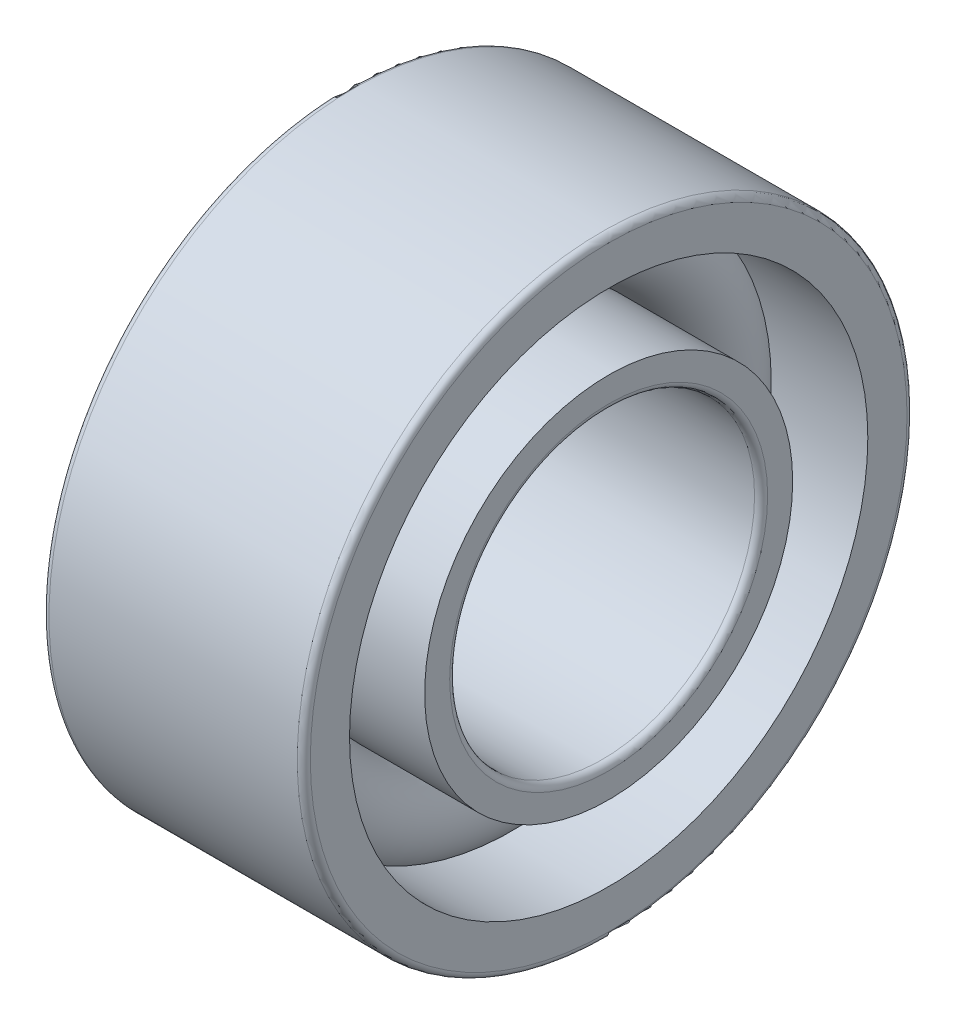
ISO-10303-21;
HEADER;
FILE_DESCRIPTION(('STEP AP214'),'2;1');
FILE_NAME('part.step','',(''),(''),'','','');
FILE_SCHEMA(('AUTOMOTIVE_DESIGN { 1 0 10303 214 1 1 1 1 }'));
ENDSEC;
DATA;
#1=APPLICATION_CONTEXT('core data for automotive mechanical design processes');
#2=APPLICATION_PROTOCOL_DEFINITION('international standard','automotive_design',2000,#1);
#3=PRODUCT_CONTEXT('',#1,'mechanical');
#4=PRODUCT('Part','Part','',(#3));
#5=PRODUCT_RELATED_PRODUCT_CATEGORY('part','',(#4));
#6=PRODUCT_DEFINITION_FORMATION('','',#4);
#7=PRODUCT_DEFINITION_CONTEXT('part definition',#1,'design');
#8=PRODUCT_DEFINITION('design','',#6,#7);
#9=PRODUCT_DEFINITION_SHAPE('','',#8);
#10=(LENGTH_UNIT() NAMED_UNIT(*) SI_UNIT(.MILLI.,.METRE.));
#11=(NAMED_UNIT(*) PLANE_ANGLE_UNIT() SI_UNIT($,.RADIAN.));
#12=(NAMED_UNIT(*) SI_UNIT($,.STERADIAN.) SOLID_ANGLE_UNIT());
#13=UNCERTAINTY_MEASURE_WITH_UNIT(LENGTH_MEASURE(1.E-05),#10,'distance_accuracy_value','');
#14=(GEOMETRIC_REPRESENTATION_CONTEXT(3) GLOBAL_UNCERTAINTY_ASSIGNED_CONTEXT((#13)) GLOBAL_UNIT_ASSIGNED_CONTEXT((#10,
#11,#12)) REPRESENTATION_CONTEXT('',''));
#15=CARTESIAN_POINT('',(0.,0.,0.));
#16=DIRECTION('',(0.,0.,1.));
#17=DIRECTION('',(1.,0.,0.));
#18=AXIS2_PLACEMENT_3D('',#15,#16,#17);
#19=CARTESIAN_POINT('',(0.,0.,0.));
#20=DIRECTION('',(-1.,0.,0.));
#21=DIRECTION('',(0.,0.,1.));
#22=AXIS2_PLACEMENT_3D('',#19,#20,#21);
#23=TOROIDAL_SURFACE('',#22,5.25,1.05);
#24=CARTESIAN_POINT('',(0.782623792124926,0.,0.));
#25=DIRECTION('',(-1.,0.,0.));
#26=DIRECTION('',(0.,0.,1.));
#27=AXIS2_PLACEMENT_3D('',#24,#25,#26);
#28=CIRCLE('',#27,5.95);
#29=CARTESIAN_POINT('',(0.782623792124926,0.,5.95));
#30=VERTEX_POINT('',#29);
#31=EDGE_CURVE('E34',#30,#30,#28,.F.);
#32=ORIENTED_EDGE('',*,*,#31,.T.);
#33=EDGE_LOOP('',(#32));
#34=FACE_BOUND('',#33,.T.);
#35=CARTESIAN_POINT('',(0.227760839478608,0.,0.));
#36=DIRECTION('',(-1.,0.,0.));
#37=DIRECTION('',(0.,0.,1.));
#38=AXIS2_PLACEMENT_3D('',#35,#36,#37);
#39=CIRCLE('',#38,4.225);
#40=CARTESIAN_POINT('',(0.227760839478608,0.,4.225));
#41=VERTEX_POINT('',#40);
#42=EDGE_CURVE('E10',#41,#41,#39,.T.);
#43=ORIENTED_EDGE('',*,*,#42,.T.);
#44=EDGE_LOOP('',(#43));
#45=FACE_BOUND('',#44,.T.);
#46=ADVANCED_FACE('F30',(#34,#45),#23,.T.);
#47=CARTESIAN_POINT('',(-20.6375,0.,0.));
#48=DIRECTION('',(1.,0.,0.));
#49=DIRECTION('',(0.,0.,-1.));
#50=AXIS2_PLACEMENT_3D('',#47,#48,#49);
#51=CYLINDRICAL_SURFACE('',#50,4.225);
#52=CARTESIAN_POINT('',(3.,0.,0.));
#53=DIRECTION('',(1.,0.,0.));
#54=DIRECTION('',(0.,0.,-1.));
#55=AXIS2_PLACEMENT_3D('',#52,#53,#54);
#56=CIRCLE('',#55,4.225);
#57=CARTESIAN_POINT('',(3.,0.,-4.225));
#58=VERTEX_POINT('',#57);
#59=EDGE_CURVE('E43',#58,#58,#56,.T.);
#60=ORIENTED_EDGE('',*,*,#59,.F.);
#61=EDGE_LOOP('',(#60));
#62=FACE_BOUND('',#61,.T.);
#63=ORIENTED_EDGE('',*,*,#42,.F.);
#64=EDGE_LOOP('',(#63));
#65=FACE_BOUND('',#64,.T.);
#66=ADVANCED_FACE('F82',(#62,#65),#51,.T.);
#67=CARTESIAN_POINT('',(-20.6375,0.,0.));
#68=DIRECTION('',(1.,0.,0.));
#69=DIRECTION('',(0.,0.,-1.));
#70=AXIS2_PLACEMENT_3D('',#67,#68,#69);
#71=CYLINDRICAL_SURFACE('',#70,4.55);
#72=CARTESIAN_POINT('',(-3.,0.,0.));
#73=DIRECTION('',(1.,0.,0.));
#74=DIRECTION('',(0.,0.,-1.));
#75=AXIS2_PLACEMENT_3D('',#72,#73,#74);
#76=CIRCLE('',#75,4.55);
#77=CARTESIAN_POINT('',(-3.,0.,-4.55));
#78=VERTEX_POINT('',#77);
#79=EDGE_CURVE('E52',#78,#78,#76,.T.);
#80=ORIENTED_EDGE('',*,*,#79,.T.);
#81=EDGE_LOOP('',(#80));
#82=FACE_BOUND('',#81,.T.);
#83=CARTESIAN_POINT('',(-0.782623792124926,0.,0.));
#84=DIRECTION('',(1.,0.,0.));
#85=DIRECTION('',(0.,0.,-1.));
#86=AXIS2_PLACEMENT_3D('',#83,#84,#85);
#87=CIRCLE('',#86,4.55);
#88=CARTESIAN_POINT('',(-0.782623792124926,0.,-4.55));
#89=VERTEX_POINT('',#88);
#90=EDGE_CURVE('E38',#89,#89,#87,.T.);
#91=ORIENTED_EDGE('',*,*,#90,.F.);
#92=EDGE_LOOP('',(#91));
#93=FACE_BOUND('',#92,.T.);
#94=ADVANCED_FACE('F85',(#82,#93),#71,.T.);
#95=CARTESIAN_POINT('',(3.,3.65,0.));
#96=DIRECTION('',(1.,0.,0.));
#97=DIRECTION('',(0.,0.,-1.));
#98=AXIS2_PLACEMENT_3D('',#95,#96,#97);
#99=PLANE('',#98);
#100=ORIENTED_EDGE('',*,*,#59,.T.);
#101=EDGE_LOOP('',(#100));
#102=FACE_BOUND('',#101,.T.);
#103=CARTESIAN_POINT('',(3.,0.,0.));
#104=DIRECTION('',(1.,0.,0.));
#105=DIRECTION('',(0.,0.,-1.));
#106=AXIS2_PLACEMENT_3D('',#103,#104,#105);
#107=CIRCLE('',#106,3.65);
#108=CARTESIAN_POINT('',(3.,0.,-3.65));
#109=VERTEX_POINT('',#108);
#110=EDGE_CURVE('E74',#109,#109,#107,.T.);
#111=ORIENTED_EDGE('',*,*,#110,.F.);
#112=EDGE_LOOP('',(#111));
#113=FACE_BOUND('',#112,.T.);
#114=ADVANCED_FACE('F79',(#102,#113),#99,.T.);
#115=CARTESIAN_POINT('',(2.85,0.,0.));
#116=DIRECTION('',(1.,0.,0.));
#117=DIRECTION('',(0.,0.,-1.));
#118=AXIS2_PLACEMENT_3D('',#115,#116,#117);
#119=TOROIDAL_SURFACE('',#118,3.65,0.149999999999999);
#120=ORIENTED_EDGE('',*,*,#110,.T.);
#121=EDGE_LOOP('',(#120));
#122=FACE_BOUND('',#121,.T.);
#123=CARTESIAN_POINT('',(2.85,0.,0.));
#124=DIRECTION('',(1.,0.,0.));
#125=DIRECTION('',(0.,0.,-1.));
#126=AXIS2_PLACEMENT_3D('',#123,#124,#125);
#127=CIRCLE('',#126,3.5);
#128=CARTESIAN_POINT('',(2.85,0.,-3.5));
#129=VERTEX_POINT('',#128);
#130=EDGE_CURVE('E71',#129,#129,#127,.T.);
#131=ORIENTED_EDGE('',*,*,#130,.F.);
#132=EDGE_LOOP('',(#131));
#133=FACE_BOUND('',#132,.T.);
#134=ADVANCED_FACE('F96',(#122,#133),#119,.T.);
#135=CARTESIAN_POINT('',(-20.6375,0.,0.));
#136=DIRECTION('',(1.,0.,0.));
#137=DIRECTION('',(0.,0.,-1.));
#138=AXIS2_PLACEMENT_3D('',#135,#136,#137);
#139=CYLINDRICAL_SURFACE('',#138,3.5);
#140=ORIENTED_EDGE('',*,*,#130,.T.);
#141=EDGE_LOOP('',(#140));
#142=FACE_BOUND('',#141,.T.);
#143=CARTESIAN_POINT('',(-2.85,0.,0.));
#144=DIRECTION('',(1.,0.,0.));
#145=DIRECTION('',(0.,0.,-1.));
#146=AXIS2_PLACEMENT_3D('',#143,#144,#145);
#147=CIRCLE('',#146,3.5);
#148=CARTESIAN_POINT('',(-2.85,0.,-3.5));
#149=VERTEX_POINT('',#148);
#150=EDGE_CURVE('E68',#149,#149,#147,.T.);
#151=ORIENTED_EDGE('',*,*,#150,.F.);
#152=EDGE_LOOP('',(#151));
#153=FACE_BOUND('',#152,.T.);
#154=ADVANCED_FACE('F99',(#142,#153),#139,.F.);
#155=CARTESIAN_POINT('',(-2.85,0.,0.));
#156=DIRECTION('',(1.,0.,0.));
#157=DIRECTION('',(0.,0.,-1.));
#158=AXIS2_PLACEMENT_3D('',#155,#156,#157);
#159=TOROIDAL_SURFACE('',#158,3.65,0.149999999999999);
#160=ORIENTED_EDGE('',*,*,#150,.T.);
#161=EDGE_LOOP('',(#160));
#162=FACE_BOUND('',#161,.T.);
#163=CARTESIAN_POINT('',(-3.,0.,0.));
#164=DIRECTION('',(1.,0.,0.));
#165=DIRECTION('',(0.,0.,-1.));
#166=AXIS2_PLACEMENT_3D('',#163,#164,#165);
#167=CIRCLE('',#166,3.65);
#168=CARTESIAN_POINT('',(-3.,0.,-3.65));
#169=VERTEX_POINT('',#168);
#170=EDGE_CURVE('E65',#169,#169,#167,.T.);
#171=ORIENTED_EDGE('',*,*,#170,.F.);
#172=EDGE_LOOP('',(#171));
#173=FACE_BOUND('',#172,.T.);
#174=ADVANCED_FACE('F103',(#162,#173),#159,.T.);
#175=CARTESIAN_POINT('',(-3.,4.55,0.));
#176=DIRECTION('',(-1.,0.,0.));
#177=DIRECTION('',(0.,0.,1.));
#178=AXIS2_PLACEMENT_3D('',#175,#176,#177);
#179=PLANE('',#178);
#180=ORIENTED_EDGE('',*,*,#170,.T.);
#181=EDGE_LOOP('',(#180));
#182=FACE_BOUND('',#181,.T.);
#183=ORIENTED_EDGE('',*,*,#79,.F.);
#184=EDGE_LOOP('',(#183));
#185=FACE_BOUND('',#184,.T.);
#186=ADVANCED_FACE('F107',(#182,#185),#179,.T.);
#187=CARTESIAN_POINT('',(-0.227760839478608,0.,0.));
#188=DIRECTION('',(1.,0.,0.));
#189=DIRECTION('',(0.,0.,-1.));
#190=AXIS2_PLACEMENT_3D('',#187,#188,#189);
#191=CIRCLE('',#190,6.275);
#192=CARTESIAN_POINT('',(-0.227760839478608,0.,-6.275));
#193=VERTEX_POINT('',#192);
#194=EDGE_CURVE('E46',#193,#193,#191,.F.);
#195=ORIENTED_EDGE('',*,*,#194,.T.);
#196=EDGE_LOOP('',(#195));
#197=FACE_BOUND('',#196,.T.);
#198=ORIENTED_EDGE('',*,*,#90,.T.);
#199=EDGE_LOOP('',(#198));
#200=FACE_BOUND('',#199,.T.);
#201=ADVANCED_FACE('F32',(#197,#200),#23,.T.);
#202=CARTESIAN_POINT('',(-20.6375,0.,0.));
#203=DIRECTION('',(1.,0.,0.));
#204=DIRECTION('',(0.,0.,-1.));
#205=AXIS2_PLACEMENT_3D('',#202,#203,#204);
#206=CYLINDRICAL_SURFACE('',#205,5.95);
#207=CARTESIAN_POINT('',(3.,0.,0.));
#208=DIRECTION('',(1.,0.,0.));
#209=DIRECTION('',(0.,0.,-1.));
#210=AXIS2_PLACEMENT_3D('',#207,#208,#209);
#211=CIRCLE('',#210,5.95);
#212=CARTESIAN_POINT('',(3.,0.,-5.95));
#213=VERTEX_POINT('',#212);
#214=EDGE_CURVE('E148',#213,#213,#211,.T.);
#215=ORIENTED_EDGE('',*,*,#214,.T.);
#216=EDGE_LOOP('',(#215));
#217=FACE_BOUND('',#216,.T.);
#218=ORIENTED_EDGE('',*,*,#31,.F.);
#219=EDGE_LOOP('',(#218));
#220=FACE_BOUND('',#219,.T.);
#221=ADVANCED_FACE('F129',(#217,#220),#206,.F.);
#222=CARTESIAN_POINT('',(-20.6375,0.,0.));
#223=DIRECTION('',(1.,0.,0.));
#224=DIRECTION('',(0.,0.,-1.));
#225=AXIS2_PLACEMENT_3D('',#222,#223,#224);
#226=CYLINDRICAL_SURFACE('',#225,6.275);
#227=CARTESIAN_POINT('',(-3.,0.,0.));
#228=DIRECTION('',(1.,0.,0.));
#229=DIRECTION('',(0.,0.,-1.));
#230=AXIS2_PLACEMENT_3D('',#227,#228,#229);
#231=CIRCLE('',#230,6.275);
#232=CARTESIAN_POINT('',(-3.,0.,-6.275));
#233=VERTEX_POINT('',#232);
#234=EDGE_CURVE('E143',#233,#233,#231,.T.);
#235=ORIENTED_EDGE('',*,*,#234,.F.);
#236=EDGE_LOOP('',(#235));
#237=FACE_BOUND('',#236,.T.);
#238=ORIENTED_EDGE('',*,*,#194,.F.);
#239=EDGE_LOOP('',(#238));
#240=FACE_BOUND('',#239,.T.);
#241=ADVANCED_FACE('F116',(#237,#240),#226,.F.);
#242=CARTESIAN_POINT('',(-2.85,0.,0.));
#243=DIRECTION('',(1.,0.,0.));
#244=DIRECTION('',(0.,0.,-1.));
#245=AXIS2_PLACEMENT_3D('',#242,#243,#244);
#246=TOROIDAL_SURFACE('',#245,6.85,0.150000000000002);
#247=CARTESIAN_POINT('',(-3.,0.,0.));
#248=DIRECTION('',(1.,0.,0.));
#249=DIRECTION('',(0.,0.,-1.));
#250=AXIS2_PLACEMENT_3D('',#247,#248,#249);
#251=CIRCLE('',#250,6.85);
#252=CARTESIAN_POINT('',(-3.,0.,-6.85));
#253=VERTEX_POINT('',#252);
#254=EDGE_CURVE('E146',#253,#253,#251,.T.);
#255=ORIENTED_EDGE('',*,*,#254,.T.);
#256=EDGE_LOOP('',(#255));
#257=FACE_BOUND('',#256,.T.);
#258=CARTESIAN_POINT('',(-2.85,0.,0.));
#259=DIRECTION('',(1.,0.,0.));
#260=DIRECTION('',(0.,0.,-1.));
#261=AXIS2_PLACEMENT_3D('',#258,#259,#260);
#262=CIRCLE('',#261,7.);
#263=CARTESIAN_POINT('',(-2.85,0.,-7.));
#264=VERTEX_POINT('',#263);
#265=EDGE_CURVE('E48',#264,#264,#262,.T.);
#266=ORIENTED_EDGE('',*,*,#265,.F.);
#267=EDGE_LOOP('',(#266));
#268=FACE_BOUND('',#267,.T.);
#269=ADVANCED_FACE('F112',(#257,#268),#246,.T.);
#270=CARTESIAN_POINT('',(-20.6375,0.,0.));
#271=DIRECTION('',(1.,0.,0.));
#272=DIRECTION('',(0.,0.,-1.));
#273=AXIS2_PLACEMENT_3D('',#270,#271,#272);
#274=CYLINDRICAL_SURFACE('',#273,7.);
#275=ORIENTED_EDGE('',*,*,#265,.T.);
#276=EDGE_LOOP('',(#275));
#277=FACE_BOUND('',#276,.T.);
#278=CARTESIAN_POINT('',(2.85,0.,0.));
#279=DIRECTION('',(1.,0.,0.));
#280=DIRECTION('',(0.,0.,-1.));
#281=AXIS2_PLACEMENT_3D('',#278,#279,#280);
#282=CIRCLE('',#281,7.);
#283=CARTESIAN_POINT('',(2.85,0.,-7.));
#284=VERTEX_POINT('',#283);
#285=EDGE_CURVE('E54',#284,#284,#282,.T.);
#286=ORIENTED_EDGE('',*,*,#285,.F.);
#287=EDGE_LOOP('',(#286));
#288=FACE_BOUND('',#287,.T.);
#289=ADVANCED_FACE('F115',(#277,#288),#274,.T.);
#290=CARTESIAN_POINT('',(2.85,0.,0.));
#291=DIRECTION('',(1.,0.,0.));
#292=DIRECTION('',(0.,0.,-1.));
#293=AXIS2_PLACEMENT_3D('',#290,#291,#292);
#294=TOROIDAL_SURFACE('',#293,6.85,0.150000000000002);
#295=ORIENTED_EDGE('',*,*,#285,.T.);
#296=EDGE_LOOP('',(#295));
#297=FACE_BOUND('',#296,.T.);
#298=CARTESIAN_POINT('',(3.,0.,0.));
#299=DIRECTION('',(1.,0.,0.));
#300=DIRECTION('',(0.,0.,-1.));
#301=AXIS2_PLACEMENT_3D('',#298,#299,#300);
#302=CIRCLE('',#301,6.85);
#303=CARTESIAN_POINT('',(3.,0.,-6.85));
#304=VERTEX_POINT('',#303);
#305=EDGE_CURVE('E59',#304,#304,#302,.T.);
#306=ORIENTED_EDGE('',*,*,#305,.F.);
#307=EDGE_LOOP('',(#306));
#308=FACE_BOUND('',#307,.T.);
#309=ADVANCED_FACE('F120',(#297,#308),#294,.T.);
#310=CARTESIAN_POINT('',(3.,6.85,0.));
#311=DIRECTION('',(1.,0.,0.));
#312=DIRECTION('',(0.,0.,-1.));
#313=AXIS2_PLACEMENT_3D('',#310,#311,#312);
#314=PLANE('',#313);
#315=ORIENTED_EDGE('',*,*,#305,.T.);
#316=EDGE_LOOP('',(#315));
#317=FACE_BOUND('',#316,.T.);
#318=ORIENTED_EDGE('',*,*,#214,.F.);
#319=EDGE_LOOP('',(#318));
#320=FACE_BOUND('',#319,.T.);
#321=ADVANCED_FACE('F123',(#317,#320),#314,.T.);
#322=CARTESIAN_POINT('',(-3.,6.275,0.));
#323=DIRECTION('',(-1.,0.,0.));
#324=DIRECTION('',(0.,0.,1.));
#325=AXIS2_PLACEMENT_3D('',#322,#323,#324);
#326=PLANE('',#325);
#327=ORIENTED_EDGE('',*,*,#234,.T.);
#328=EDGE_LOOP('',(#327));
#329=FACE_BOUND('',#328,.T.);
#330=ORIENTED_EDGE('',*,*,#254,.F.);
#331=EDGE_LOOP('',(#330));
#332=FACE_BOUND('',#331,.T.);
#333=ADVANCED_FACE('F127',(#329,#332),#326,.T.);
#334=CLOSED_SHELL('',(#46,#66,#94,#114,#134,#154,#174,#186,#201,#221,#241,#269,#289,#309,#321,#333));
#335=MANIFOLD_SOLID_BREP('B2',#334);
#336=ADVANCED_BREP_SHAPE_REPRESENTATION('',(#18,#335),#14);
#337=SHAPE_DEFINITION_REPRESENTATION(#9,#336);
ENDSEC;
END-ISO-10303-21;
